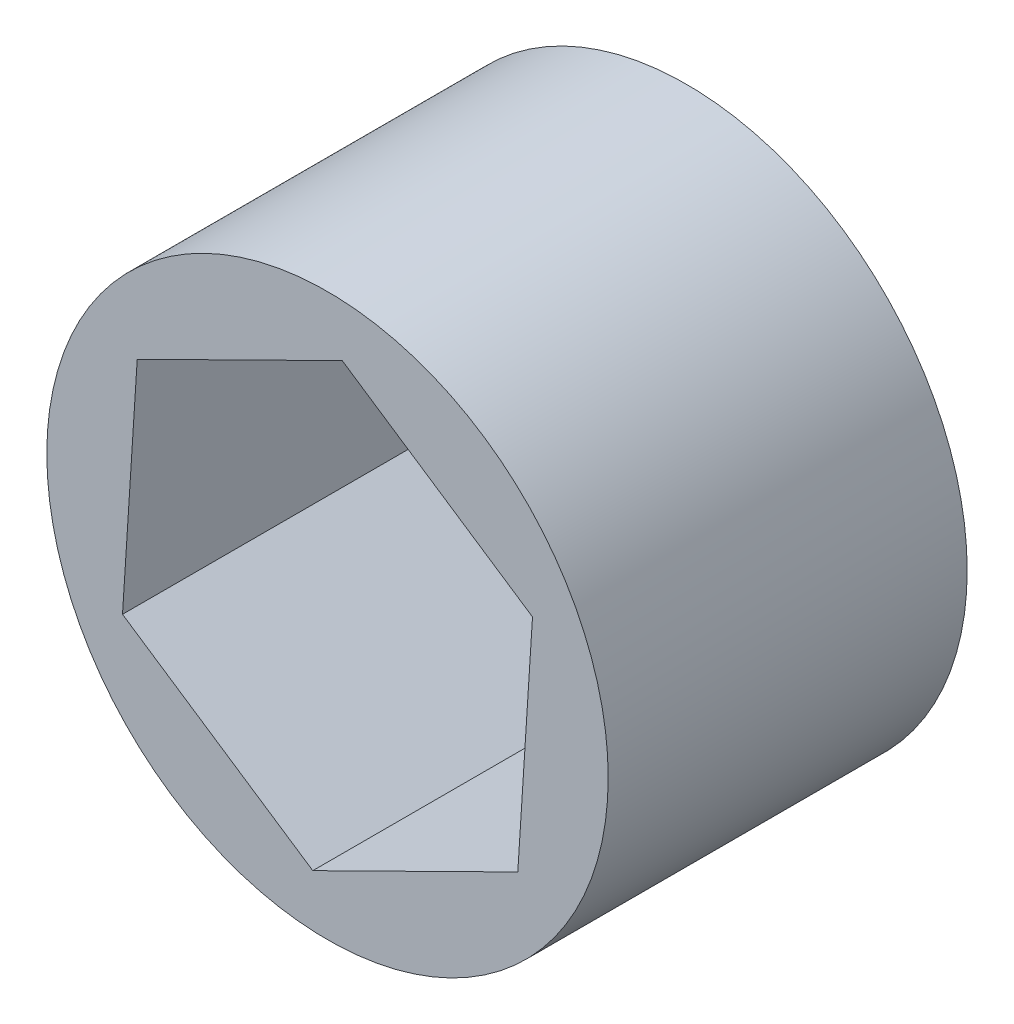
ISO-10303-21;
HEADER;
FILE_DESCRIPTION(('STEP AP214'),'2;1');
FILE_NAME('part.step','',(''),(''),'','','');
FILE_SCHEMA(('AUTOMOTIVE_DESIGN { 1 0 10303 214 1 1 1 1 }'));
ENDSEC;
DATA;
#1=APPLICATION_CONTEXT('core data for automotive mechanical design processes');
#2=APPLICATION_PROTOCOL_DEFINITION('international standard','automotive_design',2000,#1);
#3=PRODUCT_CONTEXT('',#1,'mechanical');
#4=PRODUCT('Part','Part','',(#3));
#5=PRODUCT_RELATED_PRODUCT_CATEGORY('part','',(#4));
#6=PRODUCT_DEFINITION_FORMATION('','',#4);
#7=PRODUCT_DEFINITION_CONTEXT('part definition',#1,'design');
#8=PRODUCT_DEFINITION('design','',#6,#7);
#9=PRODUCT_DEFINITION_SHAPE('','',#8);
#10=(LENGTH_UNIT() NAMED_UNIT(*) SI_UNIT(.MILLI.,.METRE.));
#11=(NAMED_UNIT(*) PLANE_ANGLE_UNIT() SI_UNIT($,.RADIAN.));
#12=(NAMED_UNIT(*) SI_UNIT($,.STERADIAN.) SOLID_ANGLE_UNIT());
#13=UNCERTAINTY_MEASURE_WITH_UNIT(LENGTH_MEASURE(1.E-05),#10,'distance_accuracy_value','');
#14=(GEOMETRIC_REPRESENTATION_CONTEXT(3) GLOBAL_UNCERTAINTY_ASSIGNED_CONTEXT((#13)) GLOBAL_UNIT_ASSIGNED_CONTEXT((#10,
#11,#12)) REPRESENTATION_CONTEXT('',''));
#15=CARTESIAN_POINT('',(0.,0.,0.));
#16=DIRECTION('',(0.,0.,1.));
#17=DIRECTION('',(1.,0.,0.));
#18=AXIS2_PLACEMENT_3D('',#15,#16,#17);
#19=CARTESIAN_POINT('',(0.,0.,11.51));
#20=DIRECTION('',(0.,0.,1.));
#21=DIRECTION('',(1.,0.,0.));
#22=AXIS2_PLACEMENT_3D('',#19,#20,#21);
#23=PLANE('',#22);
#24=CARTESIAN_POINT('',(0.,0.,11.51));
#25=DIRECTION('',(0.,0.,1.));
#26=DIRECTION('',(1.,0.,0.));
#27=AXIS2_PLACEMENT_3D('',#24,#25,#26);
#28=CIRCLE('',#27,9.);
#29=CARTESIAN_POINT('',(9.,0.,11.51));
#30=VERTEX_POINT('',#29);
#31=EDGE_CURVE('E11',#30,#30,#28,.T.);
#32=ORIENTED_EDGE('',*,*,#31,.T.);
#33=EDGE_LOOP('',(#32));
#34=FACE_BOUND('',#33,.T.);
#35=DIRECTION('',(-0.0643593142463306,-0.997926790235507,0.));
#36=VECTOR('',#35,1.);
#37=CARTESIAN_POINT('',(-6.10088265997386,4.06725510664916,11.51));
#38=LINE('',#37,#36);
#39=CARTESIAN_POINT('',(-6.10088265997386,4.06725510664916,11.51));
#40=VERTEX_POINT('',#39);
#41=CARTESIAN_POINT('',(-6.57278757601708,-3.24989181572076,11.51));
#42=VERTEX_POINT('',#41);
#43=EDGE_CURVE('E94',#40,#42,#38,.T.);
#44=ORIENTED_EDGE('',*,*,#43,.F.);
#45=DIRECTION('',(-0.896409608584179,-0.443226594010286,0.));
#46=VECTOR('',#45,1.);
#47=CARTESIAN_POINT('',(0.471904916043227,7.31714692236992,11.51));
#48=LINE('',#47,#46);
#49=CARTESIAN_POINT('',(0.471904916043227,7.31714692236992,11.51));
#50=VERTEX_POINT('',#49);
#51=EDGE_CURVE('E86',#50,#40,#48,.T.);
#52=ORIENTED_EDGE('',*,*,#51,.F.);
#53=DIRECTION('',(-0.832050294337849,0.554700196225221,0.));
#54=VECTOR('',#53,1.);
#55=CARTESIAN_POINT('',(6.57278757601709,3.24989181572076,11.51));
#56=LINE('',#55,#54);
#57=CARTESIAN_POINT('',(6.57278757601709,3.24989181572076,11.51));
#58=VERTEX_POINT('',#57);
#59=EDGE_CURVE('E114',#58,#50,#56,.T.);
#60=ORIENTED_EDGE('',*,*,#59,.F.);
#61=DIRECTION('',(0.0643593142463307,0.997926790235507,0.));
#62=VECTOR('',#61,1.);
#63=CARTESIAN_POINT('',(6.10088265997386,-4.06725510664916,11.51));
#64=LINE('',#63,#62);
#65=CARTESIAN_POINT('',(6.10088265997386,-4.06725510664916,11.51));
#66=VERTEX_POINT('',#65);
#67=EDGE_CURVE('E112',#66,#58,#64,.T.);
#68=ORIENTED_EDGE('',*,*,#67,.F.);
#69=DIRECTION('',(0.896409608584179,0.443226594010286,0.));
#70=VECTOR('',#69,1.);
#71=CARTESIAN_POINT('',(-0.471904916043223,-7.31714692236992,11.51));
#72=LINE('',#71,#70);
#73=CARTESIAN_POINT('',(-0.471904916043223,-7.31714692236992,11.51));
#74=VERTEX_POINT('',#73);
#75=EDGE_CURVE('E108',#74,#66,#72,.T.);
#76=ORIENTED_EDGE('',*,*,#75,.F.);
#77=DIRECTION('',(0.832050294337849,-0.554700196225222,0.));
#78=VECTOR('',#77,1.);
#79=CARTESIAN_POINT('',(-6.57278757601708,-3.24989181572076,11.51));
#80=LINE('',#79,#78);
#81=EDGE_CURVE('E106',#42,#74,#80,.T.);
#82=ORIENTED_EDGE('',*,*,#81,.F.);
#83=EDGE_LOOP('',(#44,#52,#60,#68,#76,#82));
#84=FACE_BOUND('',#83,.T.);
#85=ADVANCED_FACE('F33',(#34,#84),#23,.T.);
#86=CARTESIAN_POINT('',(0.,0.,0.));
#87=DIRECTION('',(0.,0.,1.));
#88=DIRECTION('',(1.,0.,0.));
#89=AXIS2_PLACEMENT_3D('',#86,#87,#88);
#90=PLANE('',#89);
#91=CARTESIAN_POINT('',(0.,0.,0.));
#92=DIRECTION('',(0.,0.,1.));
#93=DIRECTION('',(1.,0.,0.));
#94=AXIS2_PLACEMENT_3D('',#91,#92,#93);
#95=CIRCLE('',#94,9.);
#96=CARTESIAN_POINT('',(9.,0.,0.));
#97=VERTEX_POINT('',#96);
#98=EDGE_CURVE('E37',#97,#97,#95,.T.);
#99=ORIENTED_EDGE('',*,*,#98,.F.);
#100=EDGE_LOOP('',(#99));
#101=FACE_BOUND('',#100,.T.);
#102=DIRECTION('',(-0.896409608584179,-0.443226594010286,0.));
#103=VECTOR('',#102,1.);
#104=CARTESIAN_POINT('',(0.471904916043227,7.31714692236992,0.));
#105=LINE('',#104,#103);
#106=CARTESIAN_POINT('',(0.471904916043227,7.31714692236992,0.));
#107=VERTEX_POINT('',#106);
#108=CARTESIAN_POINT('',(-6.10088265997386,4.06725510664916,0.));
#109=VERTEX_POINT('',#108);
#110=EDGE_CURVE('E56',#107,#109,#105,.T.);
#111=ORIENTED_EDGE('',*,*,#110,.T.);
#112=DIRECTION('',(-0.0643593142463306,-0.997926790235507,0.));
#113=VECTOR('',#112,1.);
#114=CARTESIAN_POINT('',(-6.10088265997386,4.06725510664916,0.));
#115=LINE('',#114,#113);
#116=CARTESIAN_POINT('',(-6.57278757601708,-3.24989181572076,0.));
#117=VERTEX_POINT('',#116);
#118=EDGE_CURVE('E101',#109,#117,#115,.T.);
#119=ORIENTED_EDGE('',*,*,#118,.T.);
#120=DIRECTION('',(0.832050294337849,-0.554700196225222,0.));
#121=VECTOR('',#120,1.);
#122=CARTESIAN_POINT('',(-6.57278757601708,-3.24989181572076,0.));
#123=LINE('',#122,#121);
#124=CARTESIAN_POINT('',(-0.471904916043223,-7.31714692236992,0.));
#125=VERTEX_POINT('',#124);
#126=EDGE_CURVE('E118',#117,#125,#123,.T.);
#127=ORIENTED_EDGE('',*,*,#126,.T.);
#128=DIRECTION('',(0.896409608584179,0.443226594010286,0.));
#129=VECTOR('',#128,1.);
#130=CARTESIAN_POINT('',(-0.471904916043223,-7.31714692236992,0.));
#131=LINE('',#130,#129);
#132=CARTESIAN_POINT('',(6.10088265997386,-4.06725510664916,0.));
#133=VERTEX_POINT('',#132);
#134=EDGE_CURVE('E121',#125,#133,#131,.T.);
#135=ORIENTED_EDGE('',*,*,#134,.T.);
#136=DIRECTION('',(0.0643593142463307,0.997926790235507,0.));
#137=VECTOR('',#136,1.);
#138=CARTESIAN_POINT('',(6.10088265997386,-4.06725510664916,0.));
#139=LINE('',#138,#137);
#140=CARTESIAN_POINT('',(6.57278757601709,3.24989181572076,0.));
#141=VERTEX_POINT('',#140);
#142=EDGE_CURVE('E124',#133,#141,#139,.T.);
#143=ORIENTED_EDGE('',*,*,#142,.T.);
#144=DIRECTION('',(-0.832050294337849,0.554700196225221,0.));
#145=VECTOR('',#144,1.);
#146=CARTESIAN_POINT('',(6.57278757601709,3.24989181572076,0.));
#147=LINE('',#146,#145);
#148=EDGE_CURVE('E95',#141,#107,#147,.T.);
#149=ORIENTED_EDGE('',*,*,#148,.T.);
#150=EDGE_LOOP('',(#111,#119,#127,#135,#143,#149));
#151=FACE_BOUND('',#150,.T.);
#152=ADVANCED_FACE('F141',(#101,#151),#90,.F.);
#153=CARTESIAN_POINT('',(0.,0.,11.51));
#154=DIRECTION('',(0.,0.,-1.));
#155=DIRECTION('',(-1.,0.,0.));
#156=AXIS2_PLACEMENT_3D('',#153,#154,#155);
#157=CYLINDRICAL_SURFACE('',#156,9.);
#158=ORIENTED_EDGE('',*,*,#31,.F.);
#159=EDGE_LOOP('',(#158));
#160=FACE_BOUND('',#159,.T.);
#161=ORIENTED_EDGE('',*,*,#98,.T.);
#162=EDGE_LOOP('',(#161));
#163=FACE_BOUND('',#162,.T.);
#164=ADVANCED_FACE('F35',(#160,#163),#157,.T.);
#165=CARTESIAN_POINT('',(0.471904916043227,7.31714692236992,11.51));
#166=DIRECTION('',(0.443226594010286,-0.896409608584179,0.));
#167=DIRECTION('',(0.896409608584179,0.443226594010286,0.));
#168=AXIS2_PLACEMENT_3D('',#165,#166,#167);
#169=PLANE('',#168);
#170=ORIENTED_EDGE('',*,*,#110,.F.);
#171=DIRECTION('',(0.,0.,-1.));
#172=VECTOR('',#171,1.);
#173=CARTESIAN_POINT('',(0.471904916043227,7.31714692236992,11.51));
#174=LINE('',#173,#172);
#175=EDGE_CURVE('E90',#50,#107,#174,.T.);
#176=ORIENTED_EDGE('',*,*,#175,.F.);
#177=ORIENTED_EDGE('',*,*,#51,.T.);
#178=DIRECTION('',(0.,0.,-1.));
#179=VECTOR('',#178,1.);
#180=CARTESIAN_POINT('',(-6.10088265997386,4.06725510664916,11.51));
#181=LINE('',#180,#179);
#182=EDGE_CURVE('E89',#40,#109,#181,.T.);
#183=ORIENTED_EDGE('',*,*,#182,.T.);
#184=EDGE_LOOP('',(#170,#176,#177,#183));
#185=FACE_BOUND('',#184,.T.);
#186=ADVANCED_FACE('F88',(#185),#169,.T.);
#187=CARTESIAN_POINT('',(-6.10088265997386,4.06725510664916,11.51));
#188=DIRECTION('',(0.997926790235507,-0.0643593142463306,0.));
#189=DIRECTION('',(0.0643593142463306,0.997926790235507,0.));
#190=AXIS2_PLACEMENT_3D('',#187,#188,#189);
#191=PLANE('',#190);
#192=ORIENTED_EDGE('',*,*,#118,.F.);
#193=ORIENTED_EDGE('',*,*,#182,.F.);
#194=ORIENTED_EDGE('',*,*,#43,.T.);
#195=DIRECTION('',(0.,0.,-1.));
#196=VECTOR('',#195,1.);
#197=CARTESIAN_POINT('',(-6.57278757601708,-3.24989181572076,11.51));
#198=LINE('',#197,#196);
#199=EDGE_CURVE('E102',#42,#117,#198,.T.);
#200=ORIENTED_EDGE('',*,*,#199,.T.);
#201=EDGE_LOOP('',(#192,#193,#194,#200));
#202=FACE_BOUND('',#201,.T.);
#203=ADVANCED_FACE('F98',(#202),#191,.T.);
#204=CARTESIAN_POINT('',(-6.57278757601708,-3.24989181572076,11.51));
#205=DIRECTION('',(0.554700196225221,0.832050294337849,0.));
#206=DIRECTION('',(-0.832050294337849,0.554700196225222,0.));
#207=AXIS2_PLACEMENT_3D('',#204,#205,#206);
#208=PLANE('',#207);
#209=ORIENTED_EDGE('',*,*,#126,.F.);
#210=ORIENTED_EDGE('',*,*,#199,.F.);
#211=ORIENTED_EDGE('',*,*,#81,.T.);
#212=DIRECTION('',(0.,0.,-1.));
#213=VECTOR('',#212,1.);
#214=CARTESIAN_POINT('',(-0.471904916043223,-7.31714692236992,11.51));
#215=LINE('',#214,#213);
#216=EDGE_CURVE('E133',#74,#125,#215,.T.);
#217=ORIENTED_EDGE('',*,*,#216,.T.);
#218=EDGE_LOOP('',(#209,#210,#211,#217));
#219=FACE_BOUND('',#218,.T.);
#220=ADVANCED_FACE('F137',(#219),#208,.T.);
#221=CARTESIAN_POINT('',(-0.471904916043223,-7.31714692236992,11.51));
#222=DIRECTION('',(-0.443226594010286,0.896409608584179,0.));
#223=DIRECTION('',(-0.896409608584179,-0.443226594010286,0.));
#224=AXIS2_PLACEMENT_3D('',#221,#222,#223);
#225=PLANE('',#224);
#226=ORIENTED_EDGE('',*,*,#134,.F.);
#227=ORIENTED_EDGE('',*,*,#216,.F.);
#228=ORIENTED_EDGE('',*,*,#75,.T.);
#229=DIRECTION('',(0.,0.,-1.));
#230=VECTOR('',#229,1.);
#231=CARTESIAN_POINT('',(6.10088265997386,-4.06725510664916,11.51));
#232=LINE('',#231,#230);
#233=EDGE_CURVE('E131',#66,#133,#232,.T.);
#234=ORIENTED_EDGE('',*,*,#233,.T.);
#235=EDGE_LOOP('',(#226,#227,#228,#234));
#236=FACE_BOUND('',#235,.T.);
#237=ADVANCED_FACE('F149',(#236),#225,.T.);
#238=CARTESIAN_POINT('',(6.10088265997386,-4.06725510664916,11.51));
#239=DIRECTION('',(-0.997926790235507,0.0643593142463307,0.));
#240=DIRECTION('',(-0.0643593142463307,-0.997926790235507,0.));
#241=AXIS2_PLACEMENT_3D('',#238,#239,#240);
#242=PLANE('',#241);
#243=ORIENTED_EDGE('',*,*,#142,.F.);
#244=ORIENTED_EDGE('',*,*,#233,.F.);
#245=ORIENTED_EDGE('',*,*,#67,.T.);
#246=DIRECTION('',(0.,0.,-1.));
#247=VECTOR('',#246,1.);
#248=CARTESIAN_POINT('',(6.57278757601709,3.24989181572076,11.51));
#249=LINE('',#248,#247);
#250=EDGE_CURVE('E48',#58,#141,#249,.T.);
#251=ORIENTED_EDGE('',*,*,#250,.T.);
#252=EDGE_LOOP('',(#243,#244,#245,#251));
#253=FACE_BOUND('',#252,.T.);
#254=ADVANCED_FACE('F147',(#253),#242,.T.);
#255=CARTESIAN_POINT('',(6.57278757601709,3.24989181572076,11.51));
#256=DIRECTION('',(-0.554700196225221,-0.832050294337849,0.));
#257=DIRECTION('',(0.832050294337849,-0.554700196225221,0.));
#258=AXIS2_PLACEMENT_3D('',#255,#256,#257);
#259=PLANE('',#258);
#260=ORIENTED_EDGE('',*,*,#148,.F.);
#261=ORIENTED_EDGE('',*,*,#250,.F.);
#262=ORIENTED_EDGE('',*,*,#59,.T.);
#263=ORIENTED_EDGE('',*,*,#175,.T.);
#264=EDGE_LOOP('',(#260,#261,#262,#263));
#265=FACE_BOUND('',#264,.T.);
#266=ADVANCED_FACE('F143',(#265),#259,.T.);
#267=CLOSED_SHELL('',(#85,#152,#164,#186,#203,#220,#237,#254,#266));
#268=MANIFOLD_SOLID_BREP('B2',#267);
#269=ADVANCED_BREP_SHAPE_REPRESENTATION('',(#18,#268),#14);
#270=SHAPE_DEFINITION_REPRESENTATION(#9,#269);
ENDSEC;
END-ISO-10303-21;
